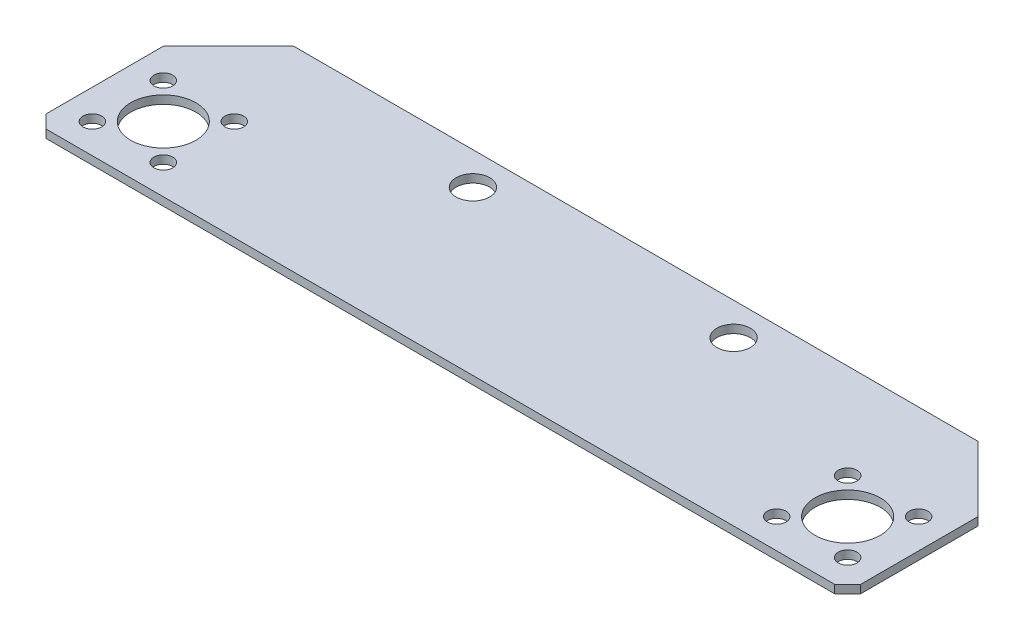
ISO-10303-21;
HEADER;
FILE_DESCRIPTION(('STEP AP214'),'2;1');
FILE_NAME('part.step','',(''),(''),'','','');
FILE_SCHEMA(('AUTOMOTIVE_DESIGN { 1 0 10303 214 1 1 1 1 }'));
ENDSEC;
DATA;
#1=APPLICATION_CONTEXT('core data for automotive mechanical design processes');
#2=APPLICATION_PROTOCOL_DEFINITION('international standard','automotive_design',2000,#1);
#3=PRODUCT_CONTEXT('',#1,'mechanical');
#4=PRODUCT('Part','Part','',(#3));
#5=PRODUCT_RELATED_PRODUCT_CATEGORY('part','',(#4));
#6=PRODUCT_DEFINITION_FORMATION('','',#4);
#7=PRODUCT_DEFINITION_CONTEXT('part definition',#1,'design');
#8=PRODUCT_DEFINITION('design','',#6,#7);
#9=PRODUCT_DEFINITION_SHAPE('','',#8);
#10=(LENGTH_UNIT() NAMED_UNIT(*) SI_UNIT(.MILLI.,.METRE.));
#11=(NAMED_UNIT(*) PLANE_ANGLE_UNIT() SI_UNIT($,.RADIAN.));
#12=(NAMED_UNIT(*) SI_UNIT($,.STERADIAN.) SOLID_ANGLE_UNIT());
#13=UNCERTAINTY_MEASURE_WITH_UNIT(LENGTH_MEASURE(1.E-05),#10,'distance_accuracy_value','');
#14=(GEOMETRIC_REPRESENTATION_CONTEXT(3) GLOBAL_UNCERTAINTY_ASSIGNED_CONTEXT((#13)) GLOBAL_UNIT_ASSIGNED_CONTEXT((#10,
#11,#12)) REPRESENTATION_CONTEXT('',''));
#15=CARTESIAN_POINT('',(0.,0.,0.));
#16=DIRECTION('',(0.,0.,1.));
#17=DIRECTION('',(1.,0.,0.));
#18=AXIS2_PLACEMENT_3D('',#15,#16,#17);
#19=CARTESIAN_POINT('',(0.,0.,0.));
#20=DIRECTION('',(0.,-1.,0.));
#21=DIRECTION('',(0.,0.,-1.));
#22=AXIS2_PLACEMENT_3D('',#19,#20,#21);
#23=PLANE('',#22);
#24=CARTESIAN_POINT('',(53.975,0.,-31.75));
#25=DIRECTION('',(0.,1.,0.));
#26=DIRECTION('',(0.,0.,1.));
#27=AXIS2_PLACEMENT_3D('',#24,#25,#26);
#28=CIRCLE('',#27,3.26389999999999);
#29=CARTESIAN_POINT('',(53.975,0.,-28.4861));
#30=VERTEX_POINT('',#29);
#31=EDGE_CURVE('E337',#30,#30,#28,.T.);
#32=ORIENTED_EDGE('',*,*,#31,.T.);
#33=EDGE_LOOP('',(#32));
#34=FACE_BOUND('',#33,.T.);
#35=CARTESIAN_POINT('',(104.775,0.,-31.75));
#36=DIRECTION('',(0.,1.,0.));
#37=DIRECTION('',(0.,0.,1.));
#38=AXIS2_PLACEMENT_3D('',#35,#36,#37);
#39=CIRCLE('',#38,3.2639);
#40=CARTESIAN_POINT('',(104.775,0.,-28.4861));
#41=VERTEX_POINT('',#40);
#42=EDGE_CURVE('E331',#41,#41,#39,.T.);
#43=ORIENTED_EDGE('',*,*,#42,.T.);
#44=EDGE_LOOP('',(#43));
#45=FACE_BOUND('',#44,.T.);
#46=DIRECTION('',(-1.,0.,0.));
#47=VECTOR('',#46,1.);
#48=CARTESIAN_POINT('',(0.,0.,-38.1));
#49=LINE('',#48,#47);
#50=CARTESIAN_POINT('',(146.05,0.,-38.1));
#51=VERTEX_POINT('',#50);
#52=CARTESIAN_POINT('',(12.7,0.,-38.1));
#53=VERTEX_POINT('',#52);
#54=EDGE_CURVE('E125',#51,#53,#49,.T.);
#55=ORIENTED_EDGE('',*,*,#54,.F.);
#56=DIRECTION('',(-0.707106781186545,0.,-0.70710678118655));
#57=VECTOR('',#56,1.);
#58=CARTESIAN_POINT('',(92.0750000000005,0.,-92.0749999999999));
#59=LINE('',#58,#57);
#60=CARTESIAN_POINT('',(158.75,0.,-25.3999999999999));
#61=VERTEX_POINT('',#60);
#62=EDGE_CURVE('E124',#51,#61,#59,.F.);
#63=ORIENTED_EDGE('',*,*,#62,.T.);
#64=DIRECTION('',(0.,0.,-1.));
#65=VECTOR('',#64,1.);
#66=CARTESIAN_POINT('',(158.75,0.,0.));
#67=LINE('',#66,#65);
#68=CARTESIAN_POINT('',(158.75,0.,-2.54000000000003));
#69=VERTEX_POINT('',#68);
#70=EDGE_CURVE('E118',#69,#61,#67,.T.);
#71=ORIENTED_EDGE('',*,*,#70,.F.);
#72=DIRECTION('',(0.70710678118655,0.,-0.707106781186546));
#73=VECTOR('',#72,1.);
#74=CARTESIAN_POINT('',(78.1049999999996,0.,78.105));
#75=LINE('',#74,#73);
#76=CARTESIAN_POINT('',(156.21,0.,0.));
#77=VERTEX_POINT('',#76);
#78=EDGE_CURVE('E104',#69,#77,#75,.F.);
#79=ORIENTED_EDGE('',*,*,#78,.T.);
#80=DIRECTION('',(1.,0.,0.));
#81=VECTOR('',#80,1.);
#82=CARTESIAN_POINT('',(0.,0.,0.));
#83=LINE('',#82,#81);
#84=CARTESIAN_POINT('',(2.54,0.,0.));
#85=VERTEX_POINT('',#84);
#86=EDGE_CURVE('E126',#85,#77,#83,.T.);
#87=ORIENTED_EDGE('',*,*,#86,.F.);
#88=DIRECTION('',(0.707106781186548,0.,0.707106781186548));
#89=VECTOR('',#88,1.);
#90=CARTESIAN_POINT('',(1.27,0.,-1.27));
#91=LINE('',#90,#89);
#92=CARTESIAN_POINT('',(0.,0.,-2.54));
#93=VERTEX_POINT('',#92);
#94=EDGE_CURVE('E115',#85,#93,#91,.F.);
#95=ORIENTED_EDGE('',*,*,#94,.T.);
#96=DIRECTION('',(0.,0.,1.));
#97=VECTOR('',#96,1.);
#98=CARTESIAN_POINT('',(0.,0.,0.));
#99=LINE('',#98,#97);
#100=CARTESIAN_POINT('',(0.,0.,-25.4));
#101=VERTEX_POINT('',#100);
#102=EDGE_CURVE('E131',#101,#93,#99,.T.);
#103=ORIENTED_EDGE('',*,*,#102,.F.);
#104=DIRECTION('',(-0.707106781186548,0.,0.707106781186547));
#105=VECTOR('',#104,1.);
#106=CARTESIAN_POINT('',(-12.7,0.,-12.7));
#107=LINE('',#106,#105);
#108=EDGE_CURVE('E152',#101,#53,#107,.F.);
#109=ORIENTED_EDGE('',*,*,#108,.T.);
#110=EDGE_LOOP('',(#55,#63,#71,#79,#87,#95,#103,#109));
#111=FACE_BOUND('',#110,.T.);
#112=CARTESIAN_POINT('',(152.964797213223,0.,-19.6147972132233));
#113=DIRECTION('',(0.,1.,0.));
#114=DIRECTION('',(0.,0.,1.));
#115=AXIS2_PLACEMENT_3D('',#112,#113,#114);
#116=CIRCLE('',#115,1.82879999999999);
#117=CARTESIAN_POINT('',(152.964797213223,0.,-17.7859972132233));
#118=VERTEX_POINT('',#117);
#119=EDGE_CURVE('E258',#118,#118,#116,.T.);
#120=ORIENTED_EDGE('',*,*,#119,.T.);
#121=EDGE_LOOP('',(#120));
#122=FACE_BOUND('',#121,.T.);
#123=CARTESIAN_POINT('',(139.135202786777,0.,-19.6147972132232));
#124=DIRECTION('',(0.,1.,0.));
#125=DIRECTION('',(0.,0.,1.));
#126=AXIS2_PLACEMENT_3D('',#123,#124,#125);
#127=CIRCLE('',#126,1.82879999999999);
#128=CARTESIAN_POINT('',(139.135202786777,0.,-17.7859972132233));
#129=VERTEX_POINT('',#128);
#130=EDGE_CURVE('E263',#129,#129,#127,.T.);
#131=ORIENTED_EDGE('',*,*,#130,.T.);
#132=EDGE_LOOP('',(#131));
#133=FACE_BOUND('',#132,.T.);
#134=CARTESIAN_POINT('',(139.135202786777,0.,-5.78520278677675));
#135=DIRECTION('',(0.,1.,0.));
#136=DIRECTION('',(0.,0.,1.));
#137=AXIS2_PLACEMENT_3D('',#134,#135,#136);
#138=CIRCLE('',#137,1.82879999999999);
#139=CARTESIAN_POINT('',(139.135202786777,0.,-3.95640278677676));
#140=VERTEX_POINT('',#139);
#141=EDGE_CURVE('E283',#140,#140,#138,.T.);
#142=ORIENTED_EDGE('',*,*,#141,.T.);
#143=EDGE_LOOP('',(#142));
#144=FACE_BOUND('',#143,.T.);
#145=CARTESIAN_POINT('',(152.964797213223,0.,-5.78520278677676));
#146=DIRECTION('',(0.,1.,0.));
#147=DIRECTION('',(0.,0.,1.));
#148=AXIS2_PLACEMENT_3D('',#145,#146,#147);
#149=CIRCLE('',#148,1.82879999999999);
#150=CARTESIAN_POINT('',(152.964797213223,0.,-3.95640278677676));
#151=VERTEX_POINT('',#150);
#152=EDGE_CURVE('E289',#151,#151,#149,.T.);
#153=ORIENTED_EDGE('',*,*,#152,.T.);
#154=EDGE_LOOP('',(#153));
#155=FACE_BOUND('',#154,.T.);
#156=CARTESIAN_POINT('',(19.6147972132232,0.,-19.6147972132232));
#157=DIRECTION('',(0.,1.,0.));
#158=DIRECTION('',(0.,0.,1.));
#159=AXIS2_PLACEMENT_3D('',#156,#157,#158);
#160=CIRCLE('',#159,1.8288);
#161=CARTESIAN_POINT('',(19.6147972132232,0.,-17.7859972132233));
#162=VERTEX_POINT('',#161);
#163=EDGE_CURVE('E295',#162,#162,#160,.T.);
#164=ORIENTED_EDGE('',*,*,#163,.T.);
#165=EDGE_LOOP('',(#164));
#166=FACE_BOUND('',#165,.T.);
#167=CARTESIAN_POINT('',(5.78520278677675,0.,-5.78520278677676));
#168=DIRECTION('',(0.,1.,0.));
#169=DIRECTION('',(0.,0.,1.));
#170=AXIS2_PLACEMENT_3D('',#167,#168,#169);
#171=CIRCLE('',#170,1.8288);
#172=CARTESIAN_POINT('',(5.78520278677675,0.,-3.95640278677676));
#173=VERTEX_POINT('',#172);
#174=EDGE_CURVE('E301',#173,#173,#171,.T.);
#175=ORIENTED_EDGE('',*,*,#174,.T.);
#176=EDGE_LOOP('',(#175));
#177=FACE_BOUND('',#176,.T.);
#178=CARTESIAN_POINT('',(19.6147972132232,0.,-5.78520278677675));
#179=DIRECTION('',(0.,1.,0.));
#180=DIRECTION('',(0.,0.,1.));
#181=AXIS2_PLACEMENT_3D('',#178,#179,#180);
#182=CIRCLE('',#181,1.8288);
#183=CARTESIAN_POINT('',(19.6147972132232,0.,-3.95640278677675));
#184=VERTEX_POINT('',#183);
#185=EDGE_CURVE('E307',#184,#184,#182,.T.);
#186=ORIENTED_EDGE('',*,*,#185,.T.);
#187=EDGE_LOOP('',(#186));
#188=FACE_BOUND('',#187,.T.);
#189=CARTESIAN_POINT('',(5.78520278677674,0.,-19.6147972132233));
#190=DIRECTION('',(0.,1.,0.));
#191=DIRECTION('',(0.,0.,1.));
#192=AXIS2_PLACEMENT_3D('',#189,#190,#191);
#193=CIRCLE('',#192,1.8288);
#194=CARTESIAN_POINT('',(5.78520278677674,0.,-17.7859972132233));
#195=VERTEX_POINT('',#194);
#196=EDGE_CURVE('E313',#195,#195,#193,.T.);
#197=ORIENTED_EDGE('',*,*,#196,.T.);
#198=EDGE_LOOP('',(#197));
#199=FACE_BOUND('',#198,.T.);
#200=CARTESIAN_POINT('',(146.05,0.,-12.7));
#201=DIRECTION('',(0.,1.,0.));
#202=DIRECTION('',(0.,0.,1.));
#203=AXIS2_PLACEMENT_3D('',#200,#201,#202);
#204=CIRCLE('',#203,6.34999999999999);
#205=CARTESIAN_POINT('',(146.05,0.,-6.35));
#206=VERTEX_POINT('',#205);
#207=EDGE_CURVE('E319',#206,#206,#204,.T.);
#208=ORIENTED_EDGE('',*,*,#207,.T.);
#209=EDGE_LOOP('',(#208));
#210=FACE_BOUND('',#209,.T.);
#211=CARTESIAN_POINT('',(12.7,0.,-12.7));
#212=DIRECTION('',(0.,1.,0.));
#213=DIRECTION('',(0.,0.,1.));
#214=AXIS2_PLACEMENT_3D('',#211,#212,#213);
#215=CIRCLE('',#214,6.35);
#216=CARTESIAN_POINT('',(12.7,0.,-6.35));
#217=VERTEX_POINT('',#216);
#218=EDGE_CURVE('E325',#217,#217,#215,.T.);
#219=ORIENTED_EDGE('',*,*,#218,.T.);
#220=EDGE_LOOP('',(#219));
#221=FACE_BOUND('',#220,.T.);
#222=ADVANCED_FACE('F36',(#34,#45,#111,#122,#133,#144,#155,#166,#177,#188,#199,#210,#221),#23,.T.);
#223=CARTESIAN_POINT('',(0.,1.6002,0.));
#224=DIRECTION('',(1.,0.,0.));
#225=DIRECTION('',(0.,0.,-1.));
#226=AXIS2_PLACEMENT_3D('',#223,#224,#225);
#227=PLANE('',#226);
#228=DIRECTION('',(0.,0.,1.));
#229=VECTOR('',#228,1.);
#230=CARTESIAN_POINT('',(0.,1.6002,0.));
#231=LINE('',#230,#229);
#232=CARTESIAN_POINT('',(0.,1.6002,-25.4));
#233=VERTEX_POINT('',#232);
#234=CARTESIAN_POINT('',(0.,1.6002,-2.54));
#235=VERTEX_POINT('',#234);
#236=EDGE_CURVE('E129',#233,#235,#231,.T.);
#237=ORIENTED_EDGE('',*,*,#236,.F.);
#238=DIRECTION('',(0.,-1.,0.));
#239=VECTOR('',#238,1.);
#240=CARTESIAN_POINT('',(0.,1.6002,-25.4));
#241=LINE('',#240,#239);
#242=EDGE_CURVE('E11',#233,#101,#241,.T.);
#243=ORIENTED_EDGE('',*,*,#242,.T.);
#244=ORIENTED_EDGE('',*,*,#102,.T.);
#245=DIRECTION('',(0.,1.,0.));
#246=VECTOR('',#245,1.);
#247=CARTESIAN_POINT('',(0.,1.6002,-2.54));
#248=LINE('',#247,#246);
#249=EDGE_CURVE('E144',#93,#235,#248,.T.);
#250=ORIENTED_EDGE('',*,*,#249,.T.);
#251=EDGE_LOOP('',(#237,#243,#244,#250));
#252=FACE_BOUND('',#251,.T.);
#253=ADVANCED_FACE('F176',(#252),#227,.F.);
#254=CARTESIAN_POINT('',(0.,1.6002,0.));
#255=DIRECTION('',(0.,0.,-1.));
#256=DIRECTION('',(-1.,0.,0.));
#257=AXIS2_PLACEMENT_3D('',#254,#255,#256);
#258=PLANE('',#257);
#259=ORIENTED_EDGE('',*,*,#86,.T.);
#260=DIRECTION('',(0.,1.,0.));
#261=VECTOR('',#260,1.);
#262=CARTESIAN_POINT('',(156.21,1.6002,0.));
#263=LINE('',#262,#261);
#264=CARTESIAN_POINT('',(156.21,1.6002,0.));
#265=VERTEX_POINT('',#264);
#266=EDGE_CURVE('E109',#77,#265,#263,.T.);
#267=ORIENTED_EDGE('',*,*,#266,.T.);
#268=DIRECTION('',(1.,0.,0.));
#269=VECTOR('',#268,1.);
#270=CARTESIAN_POINT('',(0.,1.6002,0.));
#271=LINE('',#270,#269);
#272=CARTESIAN_POINT('',(2.54,1.6002,0.));
#273=VERTEX_POINT('',#272);
#274=EDGE_CURVE('E272',#273,#265,#271,.T.);
#275=ORIENTED_EDGE('',*,*,#274,.F.);
#276=DIRECTION('',(0.,-1.,0.));
#277=VECTOR('',#276,1.);
#278=CARTESIAN_POINT('',(2.54,1.6002,0.));
#279=LINE('',#278,#277);
#280=EDGE_CURVE('E114',#273,#85,#279,.T.);
#281=ORIENTED_EDGE('',*,*,#280,.T.);
#282=EDGE_LOOP('',(#259,#267,#275,#281));
#283=FACE_BOUND('',#282,.T.);
#284=ADVANCED_FACE('F182',(#283),#258,.F.);
#285=CARTESIAN_POINT('',(158.75,1.6002,0.));
#286=DIRECTION('',(-1.,0.,0.));
#287=DIRECTION('',(0.,0.,1.));
#288=AXIS2_PLACEMENT_3D('',#285,#286,#287);
#289=PLANE('',#288);
#290=ORIENTED_EDGE('',*,*,#70,.T.);
#291=DIRECTION('',(0.,1.,0.));
#292=VECTOR('',#291,1.);
#293=CARTESIAN_POINT('',(158.75,1.6002,-25.3999999999999));
#294=LINE('',#293,#292);
#295=CARTESIAN_POINT('',(158.75,1.6002,-25.3999999999999));
#296=VERTEX_POINT('',#295);
#297=EDGE_CURVE('E59',#61,#296,#294,.T.);
#298=ORIENTED_EDGE('',*,*,#297,.T.);
#299=DIRECTION('',(0.,0.,-1.));
#300=VECTOR('',#299,1.);
#301=CARTESIAN_POINT('',(158.75,1.6002,0.));
#302=LINE('',#301,#300);
#303=CARTESIAN_POINT('',(158.75,1.6002,-2.54));
#304=VERTEX_POINT('',#303);
#305=EDGE_CURVE('E119',#304,#296,#302,.T.);
#306=ORIENTED_EDGE('',*,*,#305,.F.);
#307=DIRECTION('',(0.,-1.,0.));
#308=VECTOR('',#307,1.);
#309=CARTESIAN_POINT('',(158.75,1.6002,-2.54));
#310=LINE('',#309,#308);
#311=EDGE_CURVE('E108',#304,#69,#310,.T.);
#312=ORIENTED_EDGE('',*,*,#311,.T.);
#313=EDGE_LOOP('',(#290,#298,#306,#312));
#314=FACE_BOUND('',#313,.T.);
#315=ADVANCED_FACE('F117',(#314),#289,.F.);
#316=CARTESIAN_POINT('',(0.,1.6002,-38.1));
#317=DIRECTION('',(0.,0.,1.));
#318=DIRECTION('',(1.,0.,0.));
#319=AXIS2_PLACEMENT_3D('',#316,#317,#318);
#320=PLANE('',#319);
#321=DIRECTION('',(-1.,0.,0.));
#322=VECTOR('',#321,1.);
#323=CARTESIAN_POINT('',(0.,1.6002,-38.1));
#324=LINE('',#323,#322);
#325=CARTESIAN_POINT('',(146.05,1.6002,-38.1));
#326=VERTEX_POINT('',#325);
#327=CARTESIAN_POINT('',(12.7,1.6002,-38.1));
#328=VERTEX_POINT('',#327);
#329=EDGE_CURVE('E120',#326,#328,#324,.T.);
#330=ORIENTED_EDGE('',*,*,#329,.F.);
#331=DIRECTION('',(0.,-1.,0.));
#332=VECTOR('',#331,1.);
#333=CARTESIAN_POINT('',(146.05,1.6002,-38.1));
#334=LINE('',#333,#332);
#335=EDGE_CURVE('E149',#326,#51,#334,.T.);
#336=ORIENTED_EDGE('',*,*,#335,.T.);
#337=ORIENTED_EDGE('',*,*,#54,.T.);
#338=DIRECTION('',(0.,1.,0.));
#339=VECTOR('',#338,1.);
#340=CARTESIAN_POINT('',(12.7,1.6002,-38.1));
#341=LINE('',#340,#339);
#342=EDGE_CURVE('E147',#53,#328,#341,.T.);
#343=ORIENTED_EDGE('',*,*,#342,.T.);
#344=EDGE_LOOP('',(#330,#336,#337,#343));
#345=FACE_BOUND('',#344,.T.);
#346=ADVANCED_FACE('F162',(#345),#320,.F.);
#347=CARTESIAN_POINT('',(0.,1.6002,0.));
#348=DIRECTION('',(0.,-1.,0.));
#349=DIRECTION('',(0.,0.,-1.));
#350=AXIS2_PLACEMENT_3D('',#347,#348,#349);
#351=PLANE('',#350);
#352=CARTESIAN_POINT('',(53.975,1.6002,-31.75));
#353=DIRECTION('',(0.,1.,0.));
#354=DIRECTION('',(0.,0.,1.));
#355=AXIS2_PLACEMENT_3D('',#352,#353,#354);
#356=CIRCLE('',#355,3.26389999999999);
#357=CARTESIAN_POINT('',(53.975,1.6002,-28.4861));
#358=VERTEX_POINT('',#357);
#359=EDGE_CURVE('E339',#358,#358,#356,.T.);
#360=ORIENTED_EDGE('',*,*,#359,.F.);
#361=EDGE_LOOP('',(#360));
#362=FACE_BOUND('',#361,.T.);
#363=CARTESIAN_POINT('',(104.775,1.6002,-31.75));
#364=DIRECTION('',(0.,1.,0.));
#365=DIRECTION('',(0.,0.,1.));
#366=AXIS2_PLACEMENT_3D('',#363,#364,#365);
#367=CIRCLE('',#366,3.26389999999999);
#368=CARTESIAN_POINT('',(104.775,1.6002,-28.4861));
#369=VERTEX_POINT('',#368);
#370=EDGE_CURVE('E334',#369,#369,#367,.T.);
#371=ORIENTED_EDGE('',*,*,#370,.F.);
#372=EDGE_LOOP('',(#371));
#373=FACE_BOUND('',#372,.T.);
#374=CARTESIAN_POINT('',(12.7,1.6002,-12.7));
#375=DIRECTION('',(0.,1.,0.));
#376=DIRECTION('',(0.,0.,1.));
#377=AXIS2_PLACEMENT_3D('',#374,#375,#376);
#378=CIRCLE('',#377,6.35);
#379=CARTESIAN_POINT('',(12.7,1.6002,-6.35));
#380=VERTEX_POINT('',#379);
#381=EDGE_CURVE('E328',#380,#380,#378,.T.);
#382=ORIENTED_EDGE('',*,*,#381,.F.);
#383=EDGE_LOOP('',(#382));
#384=FACE_BOUND('',#383,.T.);
#385=CARTESIAN_POINT('',(146.05,1.6002,-12.7));
#386=DIRECTION('',(0.,1.,0.));
#387=DIRECTION('',(0.,0.,1.));
#388=AXIS2_PLACEMENT_3D('',#385,#386,#387);
#389=CIRCLE('',#388,6.34999999999999);
#390=CARTESIAN_POINT('',(146.05,1.6002,-6.35));
#391=VERTEX_POINT('',#390);
#392=EDGE_CURVE('E322',#391,#391,#389,.T.);
#393=ORIENTED_EDGE('',*,*,#392,.F.);
#394=EDGE_LOOP('',(#393));
#395=FACE_BOUND('',#394,.T.);
#396=CARTESIAN_POINT('',(5.78520278677674,1.6002,-19.6147972132233));
#397=DIRECTION('',(0.,1.,0.));
#398=DIRECTION('',(0.,0.,1.));
#399=AXIS2_PLACEMENT_3D('',#396,#397,#398);
#400=CIRCLE('',#399,1.82879999999999);
#401=CARTESIAN_POINT('',(5.78520278677674,1.6002,-17.7859972132233));
#402=VERTEX_POINT('',#401);
#403=EDGE_CURVE('E316',#402,#402,#400,.T.);
#404=ORIENTED_EDGE('',*,*,#403,.F.);
#405=EDGE_LOOP('',(#404));
#406=FACE_BOUND('',#405,.T.);
#407=CARTESIAN_POINT('',(19.6147972132232,1.6002,-5.78520278677675));
#408=DIRECTION('',(0.,1.,0.));
#409=DIRECTION('',(0.,0.,1.));
#410=AXIS2_PLACEMENT_3D('',#407,#408,#409);
#411=CIRCLE('',#410,1.82879999999999);
#412=CARTESIAN_POINT('',(19.6147972132232,1.6002,-3.95640278677676));
#413=VERTEX_POINT('',#412);
#414=EDGE_CURVE('E310',#413,#413,#411,.T.);
#415=ORIENTED_EDGE('',*,*,#414,.F.);
#416=EDGE_LOOP('',(#415));
#417=FACE_BOUND('',#416,.T.);
#418=CARTESIAN_POINT('',(5.78520278677675,1.6002,-5.78520278677676));
#419=DIRECTION('',(0.,1.,0.));
#420=DIRECTION('',(0.,0.,1.));
#421=AXIS2_PLACEMENT_3D('',#418,#419,#420);
#422=CIRCLE('',#421,1.82879999999999);
#423=CARTESIAN_POINT('',(5.78520278677675,1.6002,-3.95640278677677));
#424=VERTEX_POINT('',#423);
#425=EDGE_CURVE('E304',#424,#424,#422,.T.);
#426=ORIENTED_EDGE('',*,*,#425,.F.);
#427=EDGE_LOOP('',(#426));
#428=FACE_BOUND('',#427,.T.);
#429=CARTESIAN_POINT('',(19.6147972132232,1.6002,-19.6147972132232));
#430=DIRECTION('',(0.,1.,0.));
#431=DIRECTION('',(0.,0.,1.));
#432=AXIS2_PLACEMENT_3D('',#429,#430,#431);
#433=CIRCLE('',#432,1.82879999999999);
#434=CARTESIAN_POINT('',(19.6147972132232,1.6002,-17.7859972132233));
#435=VERTEX_POINT('',#434);
#436=EDGE_CURVE('E298',#435,#435,#433,.T.);
#437=ORIENTED_EDGE('',*,*,#436,.F.);
#438=EDGE_LOOP('',(#437));
#439=FACE_BOUND('',#438,.T.);
#440=CARTESIAN_POINT('',(152.964797213223,1.6002,-5.78520278677676));
#441=DIRECTION('',(0.,1.,0.));
#442=DIRECTION('',(0.,0.,1.));
#443=AXIS2_PLACEMENT_3D('',#440,#441,#442);
#444=CIRCLE('',#443,1.82879999999999);
#445=CARTESIAN_POINT('',(152.964797213223,1.6002,-3.95640278677676));
#446=VERTEX_POINT('',#445);
#447=EDGE_CURVE('E292',#446,#446,#444,.T.);
#448=ORIENTED_EDGE('',*,*,#447,.F.);
#449=EDGE_LOOP('',(#448));
#450=FACE_BOUND('',#449,.T.);
#451=CARTESIAN_POINT('',(139.135202786777,1.6002,-5.78520278677675));
#452=DIRECTION('',(0.,1.,0.));
#453=DIRECTION('',(0.,0.,1.));
#454=AXIS2_PLACEMENT_3D('',#451,#452,#453);
#455=CIRCLE('',#454,1.82879999999999);
#456=CARTESIAN_POINT('',(139.135202786777,1.6002,-3.95640278677676));
#457=VERTEX_POINT('',#456);
#458=EDGE_CURVE('E286',#457,#457,#455,.T.);
#459=ORIENTED_EDGE('',*,*,#458,.F.);
#460=EDGE_LOOP('',(#459));
#461=FACE_BOUND('',#460,.T.);
#462=CARTESIAN_POINT('',(139.135202786777,1.6002,-19.6147972132232));
#463=DIRECTION('',(0.,1.,0.));
#464=DIRECTION('',(0.,0.,1.));
#465=AXIS2_PLACEMENT_3D('',#462,#463,#464);
#466=CIRCLE('',#465,1.82879999999999);
#467=CARTESIAN_POINT('',(139.135202786777,1.6002,-17.7859972132233));
#468=VERTEX_POINT('',#467);
#469=EDGE_CURVE('E267',#468,#468,#466,.T.);
#470=ORIENTED_EDGE('',*,*,#469,.F.);
#471=EDGE_LOOP('',(#470));
#472=FACE_BOUND('',#471,.T.);
#473=CARTESIAN_POINT('',(152.964797213223,1.6002,-19.6147972132233));
#474=DIRECTION('',(0.,1.,0.));
#475=DIRECTION('',(0.,0.,1.));
#476=AXIS2_PLACEMENT_3D('',#473,#474,#475);
#477=CIRCLE('',#476,1.82879999999999);
#478=CARTESIAN_POINT('',(152.964797213223,1.6002,-17.7859972132233));
#479=VERTEX_POINT('',#478);
#480=EDGE_CURVE('E261',#479,#479,#477,.T.);
#481=ORIENTED_EDGE('',*,*,#480,.F.);
#482=EDGE_LOOP('',(#481));
#483=FACE_BOUND('',#482,.T.);
#484=ORIENTED_EDGE('',*,*,#305,.T.);
#485=DIRECTION('',(0.707106781186545,0.,0.70710678118655));
#486=VECTOR('',#485,1.);
#487=CARTESIAN_POINT('',(146.05,1.6002,-38.1));
#488=LINE('',#487,#486);
#489=EDGE_CURVE('E44',#296,#326,#488,.F.);
#490=ORIENTED_EDGE('',*,*,#489,.T.);
#491=ORIENTED_EDGE('',*,*,#329,.T.);
#492=DIRECTION('',(0.707106781186548,0.,-0.707106781186547));
#493=VECTOR('',#492,1.);
#494=CARTESIAN_POINT('',(0.,1.6002,-25.4));
#495=LINE('',#494,#493);
#496=EDGE_CURVE('E51',#328,#233,#495,.F.);
#497=ORIENTED_EDGE('',*,*,#496,.T.);
#498=ORIENTED_EDGE('',*,*,#236,.T.);
#499=DIRECTION('',(-0.707106781186548,0.,-0.707106781186548));
#500=VECTOR('',#499,1.);
#501=CARTESIAN_POINT('',(2.54,1.6002,0.));
#502=LINE('',#501,#500);
#503=EDGE_CURVE('E140',#235,#273,#502,.F.);
#504=ORIENTED_EDGE('',*,*,#503,.T.);
#505=ORIENTED_EDGE('',*,*,#274,.T.);
#506=DIRECTION('',(-0.70710678118655,0.,0.707106781186546));
#507=VECTOR('',#506,1.);
#508=CARTESIAN_POINT('',(158.75,1.6002,-2.54));
#509=LINE('',#508,#507);
#510=EDGE_CURVE('E142',#265,#304,#509,.F.);
#511=ORIENTED_EDGE('',*,*,#510,.T.);
#512=EDGE_LOOP('',(#484,#490,#491,#497,#498,#504,#505,#511));
#513=FACE_BOUND('',#512,.T.);
#514=ADVANCED_FACE('F158',(#362,#373,#384,#395,#406,#417,#428,#439,#450,#461,#472,#483,#513),
#351,.F.);
#515=CARTESIAN_POINT('',(152.964797213223,1.6002,-19.6147972132233));
#516=DIRECTION('',(0.,1.,0.));
#517=DIRECTION('',(0.,0.,1.));
#518=AXIS2_PLACEMENT_3D('',#515,#516,#517);
#519=CYLINDRICAL_SURFACE('',#518,1.82879999999999);
#520=ORIENTED_EDGE('',*,*,#119,.F.);
#521=EDGE_LOOP('',(#520));
#522=FACE_BOUND('',#521,.T.);
#523=ORIENTED_EDGE('',*,*,#480,.T.);
#524=EDGE_LOOP('',(#523));
#525=FACE_BOUND('',#524,.T.);
#526=ADVANCED_FACE('F247',(#522,#525),#519,.F.);
#527=CARTESIAN_POINT('',(139.135202786777,1.6002,-19.6147972132232));
#528=DIRECTION('',(0.,1.,0.));
#529=DIRECTION('',(0.,0.,1.));
#530=AXIS2_PLACEMENT_3D('',#527,#528,#529);
#531=CYLINDRICAL_SURFACE('',#530,1.82879999999999);
#532=ORIENTED_EDGE('',*,*,#130,.F.);
#533=EDGE_LOOP('',(#532));
#534=FACE_BOUND('',#533,.T.);
#535=ORIENTED_EDGE('',*,*,#469,.T.);
#536=EDGE_LOOP('',(#535));
#537=FACE_BOUND('',#536,.T.);
#538=ADVANCED_FACE('F244',(#534,#537),#531,.F.);
#539=CARTESIAN_POINT('',(139.135202786777,1.6002,-5.78520278677675));
#540=DIRECTION('',(0.,1.,0.));
#541=DIRECTION('',(0.,0.,1.));
#542=AXIS2_PLACEMENT_3D('',#539,#540,#541);
#543=CYLINDRICAL_SURFACE('',#542,1.82879999999999);
#544=ORIENTED_EDGE('',*,*,#141,.F.);
#545=EDGE_LOOP('',(#544));
#546=FACE_BOUND('',#545,.T.);
#547=ORIENTED_EDGE('',*,*,#458,.T.);
#548=EDGE_LOOP('',(#547));
#549=FACE_BOUND('',#548,.T.);
#550=ADVANCED_FACE('F240',(#546,#549),#543,.F.);
#551=CARTESIAN_POINT('',(152.964797213223,1.6002,-5.78520278677676));
#552=DIRECTION('',(0.,1.,0.));
#553=DIRECTION('',(0.,0.,1.));
#554=AXIS2_PLACEMENT_3D('',#551,#552,#553);
#555=CYLINDRICAL_SURFACE('',#554,1.82879999999999);
#556=ORIENTED_EDGE('',*,*,#152,.F.);
#557=EDGE_LOOP('',(#556));
#558=FACE_BOUND('',#557,.T.);
#559=ORIENTED_EDGE('',*,*,#447,.T.);
#560=EDGE_LOOP('',(#559));
#561=FACE_BOUND('',#560,.T.);
#562=ADVANCED_FACE('F236',(#558,#561),#555,.F.);
#563=CARTESIAN_POINT('',(19.6147972132232,1.6002,-19.6147972132232));
#564=DIRECTION('',(0.,1.,0.));
#565=DIRECTION('',(0.,0.,1.));
#566=AXIS2_PLACEMENT_3D('',#563,#564,#565);
#567=CYLINDRICAL_SURFACE('',#566,1.82879999999999);
#568=ORIENTED_EDGE('',*,*,#163,.F.);
#569=EDGE_LOOP('',(#568));
#570=FACE_BOUND('',#569,.T.);
#571=ORIENTED_EDGE('',*,*,#436,.T.);
#572=EDGE_LOOP('',(#571));
#573=FACE_BOUND('',#572,.T.);
#574=ADVANCED_FACE('F232',(#570,#573),#567,.F.);
#575=CARTESIAN_POINT('',(5.78520278677675,1.6002,-5.78520278677676));
#576=DIRECTION('',(0.,1.,0.));
#577=DIRECTION('',(0.,0.,1.));
#578=AXIS2_PLACEMENT_3D('',#575,#576,#577);
#579=CYLINDRICAL_SURFACE('',#578,1.82879999999999);
#580=ORIENTED_EDGE('',*,*,#174,.F.);
#581=EDGE_LOOP('',(#580));
#582=FACE_BOUND('',#581,.T.);
#583=ORIENTED_EDGE('',*,*,#425,.T.);
#584=EDGE_LOOP('',(#583));
#585=FACE_BOUND('',#584,.T.);
#586=ADVANCED_FACE('F228',(#582,#585),#579,.F.);
#587=CARTESIAN_POINT('',(19.6147972132232,1.6002,-5.78520278677675));
#588=DIRECTION('',(0.,1.,0.));
#589=DIRECTION('',(0.,0.,1.));
#590=AXIS2_PLACEMENT_3D('',#587,#588,#589);
#591=CYLINDRICAL_SURFACE('',#590,1.82879999999999);
#592=ORIENTED_EDGE('',*,*,#185,.F.);
#593=EDGE_LOOP('',(#592));
#594=FACE_BOUND('',#593,.T.);
#595=ORIENTED_EDGE('',*,*,#414,.T.);
#596=EDGE_LOOP('',(#595));
#597=FACE_BOUND('',#596,.T.);
#598=ADVANCED_FACE('F224',(#594,#597),#591,.F.);
#599=CARTESIAN_POINT('',(5.78520278677674,1.6002,-19.6147972132233));
#600=DIRECTION('',(0.,1.,0.));
#601=DIRECTION('',(0.,0.,1.));
#602=AXIS2_PLACEMENT_3D('',#599,#600,#601);
#603=CYLINDRICAL_SURFACE('',#602,1.82879999999999);
#604=ORIENTED_EDGE('',*,*,#196,.F.);
#605=EDGE_LOOP('',(#604));
#606=FACE_BOUND('',#605,.T.);
#607=ORIENTED_EDGE('',*,*,#403,.T.);
#608=EDGE_LOOP('',(#607));
#609=FACE_BOUND('',#608,.T.);
#610=ADVANCED_FACE('F220',(#606,#609),#603,.F.);
#611=CARTESIAN_POINT('',(146.05,1.6002,-12.7));
#612=DIRECTION('',(0.,1.,0.));
#613=DIRECTION('',(0.,0.,1.));
#614=AXIS2_PLACEMENT_3D('',#611,#612,#613);
#615=CYLINDRICAL_SURFACE('',#614,6.34999999999999);
#616=ORIENTED_EDGE('',*,*,#207,.F.);
#617=EDGE_LOOP('',(#616));
#618=FACE_BOUND('',#617,.T.);
#619=ORIENTED_EDGE('',*,*,#392,.T.);
#620=EDGE_LOOP('',(#619));
#621=FACE_BOUND('',#620,.T.);
#622=ADVANCED_FACE('F216',(#618,#621),#615,.F.);
#623=CARTESIAN_POINT('',(12.7,1.6002,-12.7));
#624=DIRECTION('',(0.,1.,0.));
#625=DIRECTION('',(0.,0.,1.));
#626=AXIS2_PLACEMENT_3D('',#623,#624,#625);
#627=CYLINDRICAL_SURFACE('',#626,6.35);
#628=ORIENTED_EDGE('',*,*,#218,.F.);
#629=EDGE_LOOP('',(#628));
#630=FACE_BOUND('',#629,.T.);
#631=ORIENTED_EDGE('',*,*,#381,.T.);
#632=EDGE_LOOP('',(#631));
#633=FACE_BOUND('',#632,.T.);
#634=ADVANCED_FACE('F208',(#630,#633),#627,.F.);
#635=CARTESIAN_POINT('',(104.775,1.6002,-31.75));
#636=DIRECTION('',(0.,1.,0.));
#637=DIRECTION('',(0.,0.,1.));
#638=AXIS2_PLACEMENT_3D('',#635,#636,#637);
#639=CYLINDRICAL_SURFACE('',#638,3.26389999999999);
#640=ORIENTED_EDGE('',*,*,#42,.F.);
#641=EDGE_LOOP('',(#640));
#642=FACE_BOUND('',#641,.T.);
#643=ORIENTED_EDGE('',*,*,#370,.T.);
#644=EDGE_LOOP('',(#643));
#645=FACE_BOUND('',#644,.T.);
#646=ADVANCED_FACE('F202',(#642,#645),#639,.F.);
#647=CARTESIAN_POINT('',(53.975,1.6002,-31.75));
#648=DIRECTION('',(0.,1.,0.));
#649=DIRECTION('',(0.,0.,1.));
#650=AXIS2_PLACEMENT_3D('',#647,#648,#649);
#651=CYLINDRICAL_SURFACE('',#650,3.26389999999999);
#652=ORIENTED_EDGE('',*,*,#31,.F.);
#653=EDGE_LOOP('',(#652));
#654=FACE_BOUND('',#653,.T.);
#655=ORIENTED_EDGE('',*,*,#359,.T.);
#656=EDGE_LOOP('',(#655));
#657=FACE_BOUND('',#656,.T.);
#658=ADVANCED_FACE('F198',(#654,#657),#651,.F.);
#659=CARTESIAN_POINT('',(158.75,1.6002,-2.54));
#660=DIRECTION('',(-0.707106781186546,0.,-0.70710678118655));
#661=DIRECTION('',(0.,-1.,0.));
#662=AXIS2_PLACEMENT_3D('',#659,#660,#661);
#663=PLANE('',#662);
#664=ORIENTED_EDGE('',*,*,#510,.F.);
#665=ORIENTED_EDGE('',*,*,#266,.F.);
#666=ORIENTED_EDGE('',*,*,#78,.F.);
#667=ORIENTED_EDGE('',*,*,#311,.F.);
#668=EDGE_LOOP('',(#664,#665,#666,#667));
#669=FACE_BOUND('',#668,.T.);
#670=ADVANCED_FACE('F107',(#669),#663,.F.);
#671=CARTESIAN_POINT('',(2.54,1.6002,0.));
#672=DIRECTION('',(0.707106781186548,0.,-0.707106781186548));
#673=DIRECTION('',(0.,-1.,0.));
#674=AXIS2_PLACEMENT_3D('',#671,#672,#673);
#675=PLANE('',#674);
#676=ORIENTED_EDGE('',*,*,#503,.F.);
#677=ORIENTED_EDGE('',*,*,#249,.F.);
#678=ORIENTED_EDGE('',*,*,#94,.F.);
#679=ORIENTED_EDGE('',*,*,#280,.F.);
#680=EDGE_LOOP('',(#676,#677,#678,#679));
#681=FACE_BOUND('',#680,.T.);
#682=ADVANCED_FACE('F167',(#681),#675,.F.);
#683=CARTESIAN_POINT('',(146.05,1.6002,-38.1));
#684=DIRECTION('',(-0.70710678118655,0.,0.707106781186545));
#685=DIRECTION('',(0.,-1.,0.));
#686=AXIS2_PLACEMENT_3D('',#683,#684,#685);
#687=PLANE('',#686);
#688=ORIENTED_EDGE('',*,*,#489,.F.);
#689=ORIENTED_EDGE('',*,*,#297,.F.);
#690=ORIENTED_EDGE('',*,*,#62,.F.);
#691=ORIENTED_EDGE('',*,*,#335,.F.);
#692=EDGE_LOOP('',(#688,#689,#690,#691));
#693=FACE_BOUND('',#692,.T.);
#694=ADVANCED_FACE('F165',(#693),#687,.F.);
#695=CARTESIAN_POINT('',(0.,1.6002,-25.4));
#696=DIRECTION('',(0.707106781186547,0.,0.707106781186548));
#697=DIRECTION('',(0.,-1.,0.));
#698=AXIS2_PLACEMENT_3D('',#695,#696,#697);
#699=PLANE('',#698);
#700=ORIENTED_EDGE('',*,*,#496,.F.);
#701=ORIENTED_EDGE('',*,*,#342,.F.);
#702=ORIENTED_EDGE('',*,*,#108,.F.);
#703=ORIENTED_EDGE('',*,*,#242,.F.);
#704=EDGE_LOOP('',(#700,#701,#702,#703));
#705=FACE_BOUND('',#704,.T.);
#706=ADVANCED_FACE('F38',(#705),#699,.F.);
#707=CLOSED_SHELL('',(#222,#253,#284,#315,#346,#514,#526,#538,#550,#562,#574,#586,#598,#610,
#622,#634,#646,#658,#670,#682,#694,#706));
#708=MANIFOLD_SOLID_BREP('B2',#707);
#709=ADVANCED_BREP_SHAPE_REPRESENTATION('',(#18,#708),#14);
#710=SHAPE_DEFINITION_REPRESENTATION(#9,#709);
ENDSEC;
END-ISO-10303-21;
